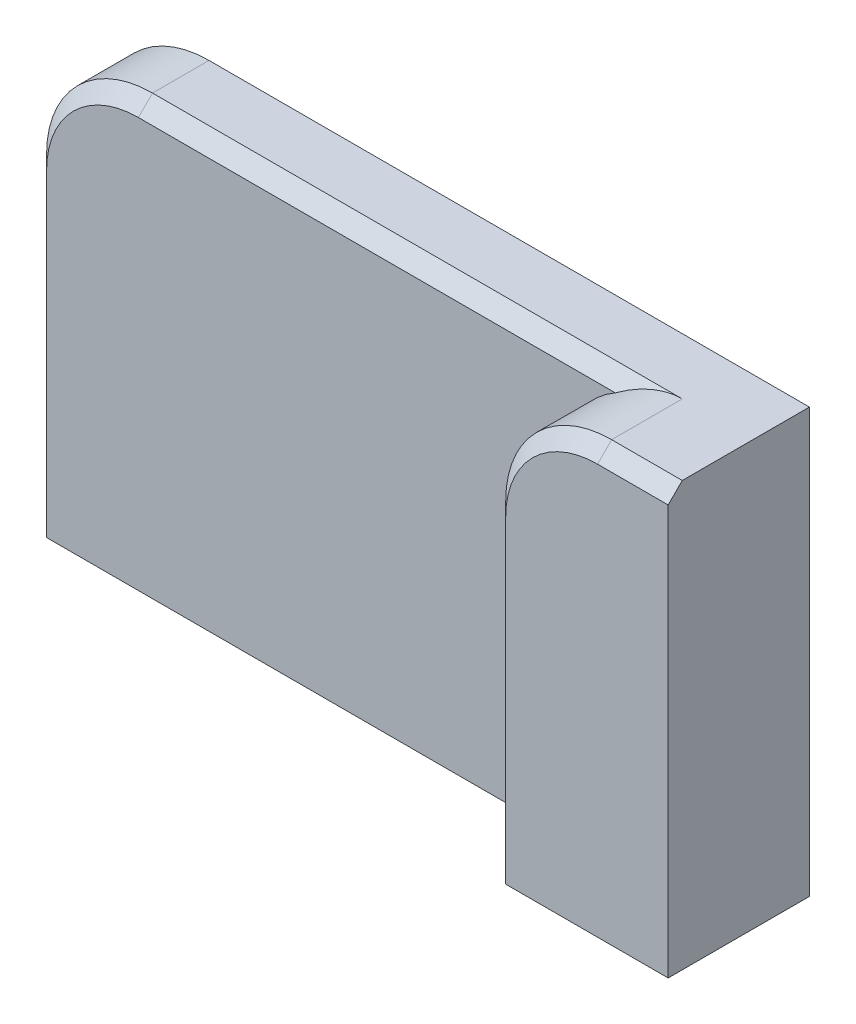
ISO-10303-21;
HEADER;
FILE_DESCRIPTION(('STEP AP214'),'2;1');
FILE_NAME('part.step','',(''),(''),'','','');
FILE_SCHEMA(('AUTOMOTIVE_DESIGN { 1 0 10303 214 1 1 1 1 }'));
ENDSEC;
DATA;
#1=APPLICATION_CONTEXT('core data for automotive mechanical design processes');
#2=APPLICATION_PROTOCOL_DEFINITION('international standard','automotive_design',2000,#1);
#3=PRODUCT_CONTEXT('',#1,'mechanical');
#4=PRODUCT('Part','Part','',(#3));
#5=PRODUCT_RELATED_PRODUCT_CATEGORY('part','',(#4));
#6=PRODUCT_DEFINITION_FORMATION('','',#4);
#7=PRODUCT_DEFINITION_CONTEXT('part definition',#1,'design');
#8=PRODUCT_DEFINITION('design','',#6,#7);
#9=PRODUCT_DEFINITION_SHAPE('','',#8);
#10=(LENGTH_UNIT() NAMED_UNIT(*) SI_UNIT(.MILLI.,.METRE.));
#11=(NAMED_UNIT(*) PLANE_ANGLE_UNIT() SI_UNIT($,.RADIAN.));
#12=(NAMED_UNIT(*) SI_UNIT($,.STERADIAN.) SOLID_ANGLE_UNIT());
#13=UNCERTAINTY_MEASURE_WITH_UNIT(LENGTH_MEASURE(1.E-05),#10,'distance_accuracy_value','');
#14=(GEOMETRIC_REPRESENTATION_CONTEXT(3) GLOBAL_UNCERTAINTY_ASSIGNED_CONTEXT((#13)) GLOBAL_UNIT_ASSIGNED_CONTEXT((#10,
#11,#12)) REPRESENTATION_CONTEXT('',''));
#15=CARTESIAN_POINT('',(0.,0.,0.));
#16=DIRECTION('',(0.,0.,1.));
#17=DIRECTION('',(1.,0.,0.));
#18=AXIS2_PLACEMENT_3D('',#15,#16,#17);
#19=CARTESIAN_POINT('',(0.,0.,0.5));
#20=DIRECTION('',(0.,0.,-1.));
#21=DIRECTION('',(-1.,0.,0.));
#22=AXIS2_PLACEMENT_3D('',#19,#20,#21);
#23=PLANE('',#22);
#24=CARTESIAN_POINT('',(4.5,2.25,0.5));
#25=DIRECTION('',(0.,0.,-1.));
#26=DIRECTION('',(-1.,0.,0.));
#27=AXIS2_PLACEMENT_3D('',#24,#25,#26);
#28=CIRCLE('',#27,0.75);
#29=CARTESIAN_POINT('',(3.75,2.25,0.5));
#30=VERTEX_POINT('',#29);
#31=CARTESIAN_POINT('',(4.12583426132261,2.9,0.5));
#32=VERTEX_POINT('',#31);
#33=EDGE_CURVE('E213',#30,#32,#28,.T.);
#34=ORIENTED_EDGE('',*,*,#33,.T.);
#35=DIRECTION('',(-1.,0.,0.));
#36=VECTOR('',#35,1.);
#37=CARTESIAN_POINT('',(0.,2.9,0.5));
#38=LINE('',#37,#36);
#39=CARTESIAN_POINT('',(0.75,2.9,0.5));
#40=VERTEX_POINT('',#39);
#41=EDGE_CURVE('E223',#32,#40,#38,.T.);
#42=ORIENTED_EDGE('',*,*,#41,.T.);
#43=CARTESIAN_POINT('',(0.75,2.25,0.5));
#44=DIRECTION('',(0.,0.,-1.));
#45=DIRECTION('',(-1.,0.,0.));
#46=AXIS2_PLACEMENT_3D('',#43,#44,#45);
#47=CIRCLE('',#46,0.650000000000001);
#48=CARTESIAN_POINT('',(0.0999999999999994,2.25,0.5));
#49=VERTEX_POINT('',#48);
#50=EDGE_CURVE('E220',#40,#49,#47,.F.);
#51=ORIENTED_EDGE('',*,*,#50,.T.);
#52=DIRECTION('',(0.,-1.,0.));
#53=VECTOR('',#52,1.);
#54=CARTESIAN_POINT('',(0.0999999999999994,0.,0.5));
#55=LINE('',#54,#53);
#56=CARTESIAN_POINT('',(0.0999999999999994,0.,0.5));
#57=VERTEX_POINT('',#56);
#58=EDGE_CURVE('E217',#49,#57,#55,.T.);
#59=ORIENTED_EDGE('',*,*,#58,.T.);
#60=DIRECTION('',(1.,0.,0.));
#61=VECTOR('',#60,1.);
#62=CARTESIAN_POINT('',(0.,0.,0.5));
#63=LINE('',#62,#61);
#64=CARTESIAN_POINT('',(3.75,0.,0.5));
#65=VERTEX_POINT('',#64);
#66=EDGE_CURVE('E176',#57,#65,#63,.T.);
#67=ORIENTED_EDGE('',*,*,#66,.T.);
#68=DIRECTION('',(0.,-1.,0.));
#69=VECTOR('',#68,1.);
#70=CARTESIAN_POINT('',(3.75,0.,0.5));
#71=LINE('',#70,#69);
#72=EDGE_CURVE('E166',#30,#65,#71,.T.);
#73=ORIENTED_EDGE('',*,*,#72,.F.);
#74=EDGE_LOOP('',(#34,#42,#51,#59,#67,#73));
#75=FACE_BOUND('',#74,.T.);
#76=ADVANCED_FACE('F41',(#75),#23,.F.);
#77=CARTESIAN_POINT('',(0.,0.,0.5));
#78=DIRECTION('',(1.,0.,0.));
#79=DIRECTION('',(0.,0.,-1.));
#80=AXIS2_PLACEMENT_3D('',#77,#78,#79);
#81=PLANE('',#80);
#82=DIRECTION('',(0.,0.,-1.));
#83=VECTOR('',#82,1.);
#84=CARTESIAN_POINT('',(0.,0.,0.5));
#85=LINE('',#84,#83);
#86=CARTESIAN_POINT('',(0.,0.,0.400000000000001));
#87=VERTEX_POINT('',#86);
#88=CARTESIAN_POINT('',(0.,0.,0.));
#89=VERTEX_POINT('',#88);
#90=EDGE_CURVE('E158',#87,#89,#85,.T.);
#91=ORIENTED_EDGE('',*,*,#90,.F.);
#92=DIRECTION('',(0.,1.,0.));
#93=VECTOR('',#92,1.);
#94=CARTESIAN_POINT('',(0.,0.,0.400000000000001));
#95=LINE('',#94,#93);
#96=CARTESIAN_POINT('',(0.,2.25,0.400000000000001));
#97=VERTEX_POINT('',#96);
#98=EDGE_CURVE('E243',#87,#97,#95,.T.);
#99=ORIENTED_EDGE('',*,*,#98,.T.);
#100=DIRECTION('',(0.,0.,-1.));
#101=VECTOR('',#100,1.);
#102=CARTESIAN_POINT('',(0.,2.25,0.5));
#103=LINE('',#102,#101);
#104=CARTESIAN_POINT('',(0.,2.25,0.));
#105=VERTEX_POINT('',#104);
#106=EDGE_CURVE('E207',#97,#105,#103,.T.);
#107=ORIENTED_EDGE('',*,*,#106,.T.);
#108=DIRECTION('',(0.,-1.,0.));
#109=VECTOR('',#108,1.);
#110=CARTESIAN_POINT('',(0.,0.,0.));
#111=LINE('',#110,#109);
#112=EDGE_CURVE('E175',#105,#89,#111,.T.);
#113=ORIENTED_EDGE('',*,*,#112,.T.);
#114=EDGE_LOOP('',(#91,#99,#107,#113));
#115=FACE_BOUND('',#114,.T.);
#116=ADVANCED_FACE('F289',(#115),#81,.F.);
#117=CARTESIAN_POINT('',(0.,0.,0.5));
#118=DIRECTION('',(0.,1.,0.));
#119=DIRECTION('',(0.,0.,1.));
#120=AXIS2_PLACEMENT_3D('',#117,#118,#119);
#121=PLANE('',#120);
#122=ORIENTED_EDGE('',*,*,#66,.F.);
#123=DIRECTION('',(0.707106781186548,0.,0.707106781186548));
#124=VECTOR('',#123,1.);
#125=CARTESIAN_POINT('',(0.0999999999999994,0.,0.5));
#126=LINE('',#125,#124);
#127=EDGE_CURVE('E240',#57,#87,#126,.F.);
#128=ORIENTED_EDGE('',*,*,#127,.T.);
#129=ORIENTED_EDGE('',*,*,#90,.T.);
#130=DIRECTION('',(1.,0.,0.));
#131=VECTOR('',#130,1.);
#132=CARTESIAN_POINT('',(0.,0.,0.));
#133=LINE('',#132,#131);
#134=CARTESIAN_POINT('',(5.,0.,0.));
#135=VERTEX_POINT('',#134);
#136=EDGE_CURVE('E153',#89,#135,#133,.T.);
#137=ORIENTED_EDGE('',*,*,#136,.T.);
#138=DIRECTION('',(0.,0.,-1.));
#139=VECTOR('',#138,1.);
#140=CARTESIAN_POINT('',(5.,0.,0.5));
#141=LINE('',#140,#139);
#142=CARTESIAN_POINT('',(5.,0.,1.));
#143=VERTEX_POINT('',#142);
#144=EDGE_CURVE('E149',#143,#135,#141,.T.);
#145=ORIENTED_EDGE('',*,*,#144,.F.);
#146=DIRECTION('',(1.,0.,0.));
#147=VECTOR('',#146,1.);
#148=CARTESIAN_POINT('',(5.,0.,1.));
#149=LINE('',#148,#147);
#150=CARTESIAN_POINT('',(3.85,0.,1.));
#151=VERTEX_POINT('',#150);
#152=EDGE_CURVE('E135',#151,#143,#149,.T.);
#153=ORIENTED_EDGE('',*,*,#152,.F.);
#154=DIRECTION('',(-0.707106781186544,0.,-0.707106781186551));
#155=VECTOR('',#154,1.);
#156=CARTESIAN_POINT('',(3.85,0.,1.));
#157=LINE('',#156,#155);
#158=CARTESIAN_POINT('',(3.75,0.,0.9));
#159=VERTEX_POINT('',#158);
#160=EDGE_CURVE('E237',#151,#159,#157,.T.);
#161=ORIENTED_EDGE('',*,*,#160,.T.);
#162=DIRECTION('',(0.,0.,-1.));
#163=VECTOR('',#162,1.);
#164=CARTESIAN_POINT('',(3.75,0.,1.));
#165=LINE('',#164,#163);
#166=EDGE_CURVE('E146',#159,#65,#165,.T.);
#167=ORIENTED_EDGE('',*,*,#166,.T.);
#168=EDGE_LOOP('',(#122,#128,#129,#137,#145,#153,#161,#167));
#169=FACE_BOUND('',#168,.T.);
#170=ADVANCED_FACE('F151',(#169),#121,.F.);
#171=CARTESIAN_POINT('',(5.,0.,0.5));
#172=DIRECTION('',(-1.,0.,0.));
#173=DIRECTION('',(0.,-1.,0.));
#174=AXIS2_PLACEMENT_3D('',#171,#172,#173);
#175=PLANE('',#174);
#176=DIRECTION('',(0.,0.,-1.));
#177=VECTOR('',#176,1.);
#178=CARTESIAN_POINT('',(5.,3.,0.5));
#179=LINE('',#178,#177);
#180=CARTESIAN_POINT('',(5.,3.,0.9));
#181=VERTEX_POINT('',#180);
#182=CARTESIAN_POINT('',(5.,3.,0.));
#183=VERTEX_POINT('',#182);
#184=EDGE_CURVE('E159',#181,#183,#179,.T.);
#185=ORIENTED_EDGE('',*,*,#184,.F.);
#186=DIRECTION('',(0.,-0.707106781186544,0.707106781186551));
#187=VECTOR('',#186,1.);
#188=CARTESIAN_POINT('',(5.,2.9,0.999999999999999));
#189=LINE('',#188,#187);
#190=CARTESIAN_POINT('',(5.,2.9,1.));
#191=VERTEX_POINT('',#190);
#192=EDGE_CURVE('E164',#181,#191,#189,.T.);
#193=ORIENTED_EDGE('',*,*,#192,.T.);
#194=DIRECTION('',(0.,1.,0.));
#195=VECTOR('',#194,1.);
#196=CARTESIAN_POINT('',(5.,0.,1.));
#197=LINE('',#196,#195);
#198=EDGE_CURVE('E140',#143,#191,#197,.T.);
#199=ORIENTED_EDGE('',*,*,#198,.F.);
#200=ORIENTED_EDGE('',*,*,#144,.T.);
#201=DIRECTION('',(0.,1.,0.));
#202=VECTOR('',#201,1.);
#203=CARTESIAN_POINT('',(5.,0.,0.));
#204=LINE('',#203,#202);
#205=EDGE_CURVE('E186',#135,#183,#204,.T.);
#206=ORIENTED_EDGE('',*,*,#205,.T.);
#207=EDGE_LOOP('',(#185,#193,#199,#200,#206));
#208=FACE_BOUND('',#207,.T.);
#209=ADVANCED_FACE('F162',(#208),#175,.F.);
#210=CARTESIAN_POINT('',(0.,3.,0.5));
#211=DIRECTION('',(0.,-1.,0.));
#212=DIRECTION('',(0.,0.,-1.));
#213=AXIS2_PLACEMENT_3D('',#210,#211,#212);
#214=PLANE('',#213);
#215=DIRECTION('',(0.,0.,-1.));
#216=VECTOR('',#215,1.);
#217=CARTESIAN_POINT('',(0.75,3.,0.5));
#218=LINE('',#217,#216);
#219=CARTESIAN_POINT('',(0.75,3.,0.));
#220=VERTEX_POINT('',#219);
#221=CARTESIAN_POINT('',(0.75,3.,0.400000000000001));
#222=VERTEX_POINT('',#221);
#223=EDGE_CURVE('E199',#220,#222,#218,.F.);
#224=ORIENTED_EDGE('',*,*,#223,.T.);
#225=DIRECTION('',(1.,0.,0.));
#226=VECTOR('',#225,1.);
#227=CARTESIAN_POINT('',(0.,3.,0.400000000000001));
#228=LINE('',#227,#226);
#229=CARTESIAN_POINT('',(4.5,3.,0.400000000000001));
#230=VERTEX_POINT('',#229);
#231=EDGE_CURVE('E230',#222,#230,#228,.T.);
#232=ORIENTED_EDGE('',*,*,#231,.T.);
#233=DIRECTION('',(0.,0.,-1.));
#234=VECTOR('',#233,1.);
#235=CARTESIAN_POINT('',(4.5,3.,0.5));
#236=LINE('',#235,#234);
#237=CARTESIAN_POINT('',(4.5,3.,0.9));
#238=VERTEX_POINT('',#237);
#239=EDGE_CURVE('E203',#230,#238,#236,.F.);
#240=ORIENTED_EDGE('',*,*,#239,.T.);
#241=DIRECTION('',(1.,0.,0.));
#242=VECTOR('',#241,1.);
#243=CARTESIAN_POINT('',(5.,3.,0.9));
#244=LINE('',#243,#242);
#245=EDGE_CURVE('E227',#238,#181,#244,.T.);
#246=ORIENTED_EDGE('',*,*,#245,.T.);
#247=ORIENTED_EDGE('',*,*,#184,.T.);
#248=DIRECTION('',(-1.,0.,0.));
#249=VECTOR('',#248,1.);
#250=CARTESIAN_POINT('',(0.,3.,0.));
#251=LINE('',#250,#249);
#252=EDGE_CURVE('E180',#183,#220,#251,.T.);
#253=ORIENTED_EDGE('',*,*,#252,.T.);
#254=EDGE_LOOP('',(#224,#232,#240,#246,#247,#253));
#255=FACE_BOUND('',#254,.T.);
#256=ADVANCED_FACE('F300',(#255),#214,.F.);
#257=CARTESIAN_POINT('',(0.,0.,0.));
#258=DIRECTION('',(0.,0.,-1.));
#259=DIRECTION('',(-1.,0.,0.));
#260=AXIS2_PLACEMENT_3D('',#257,#258,#259);
#261=PLANE('',#260);
#262=ORIENTED_EDGE('',*,*,#112,.F.);
#263=CARTESIAN_POINT('',(0.75,2.25,0.));
#264=DIRECTION('',(0.,0.,-1.));
#265=DIRECTION('',(-1.,0.,0.));
#266=AXIS2_PLACEMENT_3D('',#263,#264,#265);
#267=CIRCLE('',#266,0.75);
#268=EDGE_CURVE('E210',#105,#220,#267,.T.);
#269=ORIENTED_EDGE('',*,*,#268,.T.);
#270=ORIENTED_EDGE('',*,*,#252,.F.);
#271=ORIENTED_EDGE('',*,*,#205,.F.);
#272=ORIENTED_EDGE('',*,*,#136,.F.);
#273=EDGE_LOOP('',(#262,#269,#270,#271,#272));
#274=FACE_BOUND('',#273,.T.);
#275=ADVANCED_FACE('F297',(#274),#261,.T.);
#276=CARTESIAN_POINT('',(3.75,0.,1.));
#277=DIRECTION('',(1.,0.,0.));
#278=DIRECTION('',(0.,0.,-1.));
#279=AXIS2_PLACEMENT_3D('',#276,#277,#278);
#280=PLANE('',#279);
#281=ORIENTED_EDGE('',*,*,#166,.F.);
#282=DIRECTION('',(0.,1.,0.));
#283=VECTOR('',#282,1.);
#284=CARTESIAN_POINT('',(3.75,2.25,0.9));
#285=LINE('',#284,#283);
#286=CARTESIAN_POINT('',(3.75,2.25,0.9));
#287=VERTEX_POINT('',#286);
#288=EDGE_CURVE('E52',#159,#287,#285,.T.);
#289=ORIENTED_EDGE('',*,*,#288,.T.);
#290=DIRECTION('',(0.,0.,-1.));
#291=VECTOR('',#290,1.);
#292=CARTESIAN_POINT('',(3.75,2.25,1.));
#293=LINE('',#292,#291);
#294=EDGE_CURVE('E196',#287,#30,#293,.T.);
#295=ORIENTED_EDGE('',*,*,#294,.T.);
#296=ORIENTED_EDGE('',*,*,#72,.T.);
#297=EDGE_LOOP('',(#281,#289,#295,#296));
#298=FACE_BOUND('',#297,.T.);
#299=ADVANCED_FACE('F274',(#298),#280,.F.);
#300=CARTESIAN_POINT('',(0.,0.,1.));
#301=DIRECTION('',(0.,0.,1.));
#302=DIRECTION('',(1.,0.,0.));
#303=AXIS2_PLACEMENT_3D('',#300,#301,#302);
#304=PLANE('',#303);
#305=ORIENTED_EDGE('',*,*,#198,.T.);
#306=DIRECTION('',(-1.,0.,0.));
#307=VECTOR('',#306,1.);
#308=CARTESIAN_POINT('',(4.5,2.9,1.));
#309=LINE('',#308,#307);
#310=CARTESIAN_POINT('',(4.5,2.9,1.));
#311=VERTEX_POINT('',#310);
#312=EDGE_CURVE('E251',#191,#311,#309,.T.);
#313=ORIENTED_EDGE('',*,*,#312,.T.);
#314=CARTESIAN_POINT('',(4.5,2.25,1.));
#315=DIRECTION('',(0.,0.,1.));
#316=DIRECTION('',(1.,0.,0.));
#317=AXIS2_PLACEMENT_3D('',#314,#315,#316);
#318=CIRCLE('',#317,0.65);
#319=CARTESIAN_POINT('',(3.85,2.25,1.));
#320=VERTEX_POINT('',#319);
#321=EDGE_CURVE('E248',#311,#320,#318,.T.);
#322=ORIENTED_EDGE('',*,*,#321,.T.);
#323=DIRECTION('',(0.,-1.,0.));
#324=VECTOR('',#323,1.);
#325=CARTESIAN_POINT('',(3.85,0.,1.));
#326=LINE('',#325,#324);
#327=EDGE_CURVE('E142',#320,#151,#326,.T.);
#328=ORIENTED_EDGE('',*,*,#327,.T.);
#329=ORIENTED_EDGE('',*,*,#152,.T.);
#330=EDGE_LOOP('',(#305,#313,#322,#328,#329));
#331=FACE_BOUND('',#330,.T.);
#332=ADVANCED_FACE('F137',(#331),#304,.T.);
#333=CARTESIAN_POINT('',(4.5,2.25,1.));
#334=DIRECTION('',(0.,0.,-1.));
#335=DIRECTION('',(-1.,0.,0.));
#336=AXIS2_PLACEMENT_3D('',#333,#334,#335);
#337=CYLINDRICAL_SURFACE('',#336,0.75);
#338=ORIENTED_EDGE('',*,*,#294,.F.);
#339=CARTESIAN_POINT('',(4.5,2.25,0.9));
#340=DIRECTION('',(0.,0.,1.));
#341=DIRECTION('',(1.,0.,0.));
#342=AXIS2_PLACEMENT_3D('',#339,#340,#341);
#343=CIRCLE('',#342,0.75);
#344=EDGE_CURVE('E256',#287,#238,#343,.F.);
#345=ORIENTED_EDGE('',*,*,#344,.T.);
#346=ORIENTED_EDGE('',*,*,#239,.F.);
#347=CARTESIAN_POINT('',(4.5,2.25,1.15));
#348=DIRECTION('',(0.,-0.707106781186548,-0.707106781186548));
#349=DIRECTION('',(0.,0.707106781186548,-0.707106781186548));
#350=AXIS2_PLACEMENT_3D('',#347,#348,#349);
#351=ELLIPSE('',#350,1.06066017177982,0.75);
#352=EDGE_CURVE('E11',#230,#32,#351,.F.);
#353=ORIENTED_EDGE('',*,*,#352,.T.);
#354=ORIENTED_EDGE('',*,*,#33,.F.);
#355=EDGE_LOOP('',(#338,#345,#346,#353,#354));
#356=FACE_BOUND('',#355,.T.);
#357=ADVANCED_FACE('F304',(#356),#337,.T.);
#358=CARTESIAN_POINT('',(0.75,2.25,0.5));
#359=DIRECTION('',(0.,0.,-1.));
#360=DIRECTION('',(-1.,0.,0.));
#361=AXIS2_PLACEMENT_3D('',#358,#359,#360);
#362=CYLINDRICAL_SURFACE('',#361,0.75);
#363=ORIENTED_EDGE('',*,*,#106,.F.);
#364=CARTESIAN_POINT('',(0.75,2.25,0.400000000000001));
#365=DIRECTION('',(0.,0.,-1.));
#366=DIRECTION('',(-1.,0.,0.));
#367=AXIS2_PLACEMENT_3D('',#364,#365,#366);
#368=CIRCLE('',#367,0.75);
#369=EDGE_CURVE('E234',#97,#222,#368,.T.);
#370=ORIENTED_EDGE('',*,*,#369,.T.);
#371=ORIENTED_EDGE('',*,*,#223,.F.);
#372=ORIENTED_EDGE('',*,*,#268,.F.);
#373=EDGE_LOOP('',(#363,#370,#371,#372));
#374=FACE_BOUND('',#373,.T.);
#375=ADVANCED_FACE('F292',(#374),#362,.T.);
#376=CARTESIAN_POINT('',(0.0999999999999994,0.,0.5));
#377=DIRECTION('',(0.707106781186548,0.,-0.707106781186548));
#378=DIRECTION('',(0.,-1.,0.));
#379=AXIS2_PLACEMENT_3D('',#376,#377,#378);
#380=PLANE('',#379);
#381=ORIENTED_EDGE('',*,*,#127,.F.);
#382=ORIENTED_EDGE('',*,*,#58,.F.);
#383=DIRECTION('',(0.707106781186548,0.,0.707106781186548));
#384=VECTOR('',#383,1.);
#385=CARTESIAN_POINT('',(0.,2.25,0.400000000000001));
#386=LINE('',#385,#384);
#387=EDGE_CURVE('E170',#97,#49,#386,.T.);
#388=ORIENTED_EDGE('',*,*,#387,.F.);
#389=ORIENTED_EDGE('',*,*,#98,.F.);
#390=EDGE_LOOP('',(#381,#382,#388,#389));
#391=FACE_BOUND('',#390,.T.);
#392=ADVANCED_FACE('F284',(#391),#380,.F.);
#393=CARTESIAN_POINT('',(0.75,2.25,0.5));
#394=DIRECTION('',(0.,0.,-1.));
#395=DIRECTION('',(-1.,0.,0.));
#396=AXIS2_PLACEMENT_3D('',#393,#394,#395);
#397=CONICAL_SURFACE('',#396,0.650000000000001,0.785398163397448);
#398=ORIENTED_EDGE('',*,*,#387,.T.);
#399=ORIENTED_EDGE('',*,*,#50,.F.);
#400=DIRECTION('',(0.,-0.707106781186548,0.707106781186548));
#401=VECTOR('',#400,1.);
#402=CARTESIAN_POINT('',(0.75,3.,0.400000000000001));
#403=LINE('',#402,#401);
#404=EDGE_CURVE('E261',#222,#40,#403,.T.);
#405=ORIENTED_EDGE('',*,*,#404,.F.);
#406=ORIENTED_EDGE('',*,*,#369,.F.);
#407=EDGE_LOOP('',(#398,#399,#405,#406));
#408=FACE_BOUND('',#407,.T.);
#409=ADVANCED_FACE('F310',(#408),#397,.T.);
#410=CARTESIAN_POINT('',(0.,2.9,0.5));
#411=DIRECTION('',(0.,-0.707106781186548,-0.707106781186548));
#412=DIRECTION('',(-1.,0.,0.));
#413=AXIS2_PLACEMENT_3D('',#410,#411,#412);
#414=PLANE('',#413);
#415=ORIENTED_EDGE('',*,*,#352,.F.);
#416=ORIENTED_EDGE('',*,*,#231,.F.);
#417=ORIENTED_EDGE('',*,*,#404,.T.);
#418=ORIENTED_EDGE('',*,*,#41,.F.);
#419=EDGE_LOOP('',(#415,#416,#417,#418));
#420=FACE_BOUND('',#419,.T.);
#421=ADVANCED_FACE('F306',(#420),#414,.F.);
#422=CARTESIAN_POINT('',(3.85,0.,1.));
#423=DIRECTION('',(-0.707106781186551,0.,0.707106781186544));
#424=DIRECTION('',(0.,1.,0.));
#425=AXIS2_PLACEMENT_3D('',#422,#423,#424);
#426=PLANE('',#425);
#427=ORIENTED_EDGE('',*,*,#160,.F.);
#428=ORIENTED_EDGE('',*,*,#327,.F.);
#429=DIRECTION('',(0.707106781186544,0.,0.707106781186551));
#430=VECTOR('',#429,1.);
#431=CARTESIAN_POINT('',(3.75,2.25,0.9));
#432=LINE('',#431,#430);
#433=EDGE_CURVE('E46',#287,#320,#432,.T.);
#434=ORIENTED_EDGE('',*,*,#433,.F.);
#435=ORIENTED_EDGE('',*,*,#288,.F.);
#436=EDGE_LOOP('',(#427,#428,#434,#435));
#437=FACE_BOUND('',#436,.T.);
#438=ADVANCED_FACE('F44',(#437),#426,.T.);
#439=CARTESIAN_POINT('',(4.5,2.25,1.));
#440=DIRECTION('',(0.,0.,-1.));
#441=DIRECTION('',(-1.,0.,0.));
#442=AXIS2_PLACEMENT_3D('',#439,#440,#441);
#443=CONICAL_SURFACE('',#442,0.65,0.785398163397445);
#444=ORIENTED_EDGE('',*,*,#433,.T.);
#445=ORIENTED_EDGE('',*,*,#321,.F.);
#446=DIRECTION('',(0.,-0.707106781186544,0.707106781186551));
#447=VECTOR('',#446,1.);
#448=CARTESIAN_POINT('',(4.5,3.,0.9));
#449=LINE('',#448,#447);
#450=EDGE_CURVE('E67',#238,#311,#449,.T.);
#451=ORIENTED_EDGE('',*,*,#450,.F.);
#452=ORIENTED_EDGE('',*,*,#344,.F.);
#453=EDGE_LOOP('',(#444,#445,#451,#452));
#454=FACE_BOUND('',#453,.T.);
#455=ADVANCED_FACE('F272',(#454),#443,.T.);
#456=CARTESIAN_POINT('',(0.,2.9,1.));
#457=DIRECTION('',(0.,0.707106781186551,0.707106781186544));
#458=DIRECTION('',(1.,0.,0.));
#459=AXIS2_PLACEMENT_3D('',#456,#457,#458);
#460=PLANE('',#459);
#461=ORIENTED_EDGE('',*,*,#192,.F.);
#462=ORIENTED_EDGE('',*,*,#245,.F.);
#463=ORIENTED_EDGE('',*,*,#450,.T.);
#464=ORIENTED_EDGE('',*,*,#312,.F.);
#465=EDGE_LOOP('',(#461,#462,#463,#464));
#466=FACE_BOUND('',#465,.T.);
#467=ADVANCED_FACE('F299',(#466),#460,.T.);
#468=CLOSED_SHELL('',(#76,#116,#170,#209,#256,#275,#299,#332,#357,#375,#392,#409,#421,#438,#455,#467));
#469=MANIFOLD_SOLID_BREP('B2',#468);
#470=ADVANCED_BREP_SHAPE_REPRESENTATION('',(#18,#469),#14);
#471=SHAPE_DEFINITION_REPRESENTATION(#9,#470);
ENDSEC;
END-ISO-10303-21;
